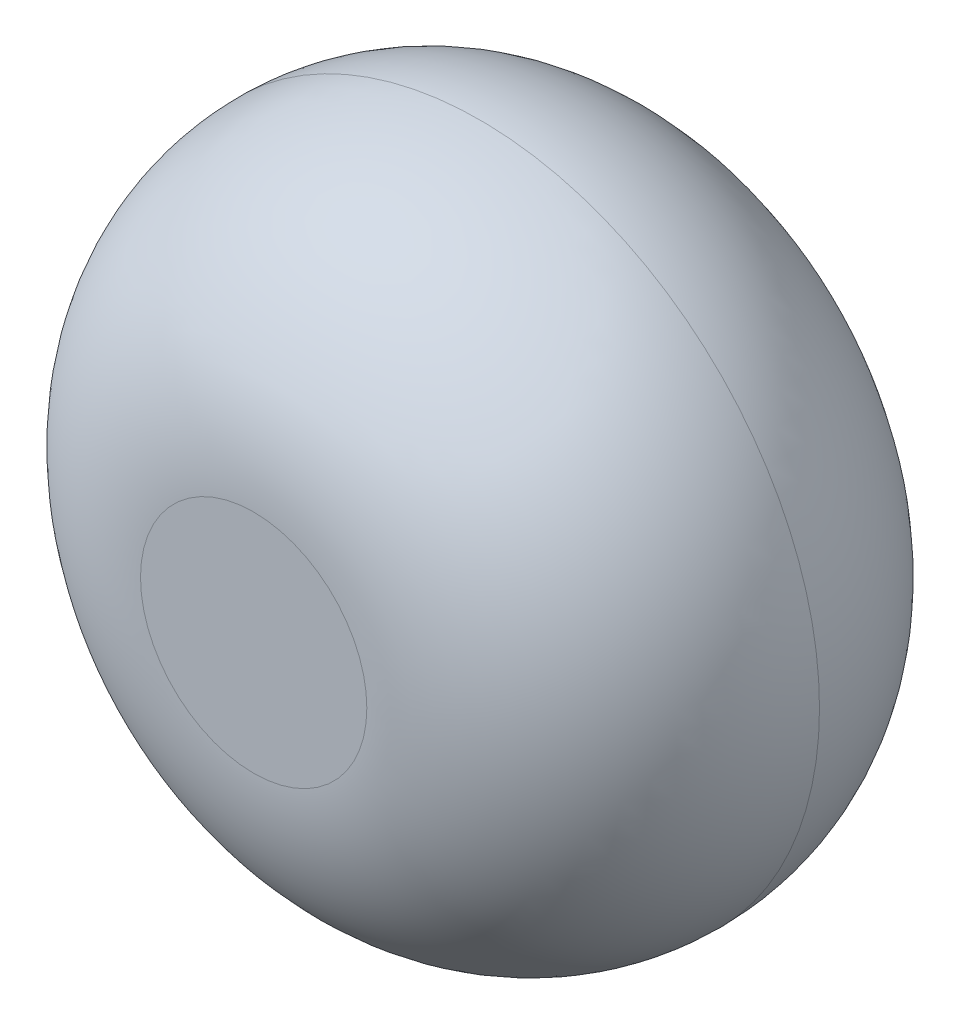
ISO-10303-21;
HEADER;
FILE_DESCRIPTION(('STEP AP214'),'2;1');
FILE_NAME('part.step','',(''),(''),'','','');
FILE_SCHEMA(('AUTOMOTIVE_DESIGN { 1 0 10303 214 1 1 1 1 }'));
ENDSEC;
DATA;
#1=APPLICATION_CONTEXT('core data for automotive mechanical design processes');
#2=APPLICATION_PROTOCOL_DEFINITION('international standard','automotive_design',2000,#1);
#3=PRODUCT_CONTEXT('',#1,'mechanical');
#4=PRODUCT('Part','Part','',(#3));
#5=PRODUCT_RELATED_PRODUCT_CATEGORY('part','',(#4));
#6=PRODUCT_DEFINITION_FORMATION('','',#4);
#7=PRODUCT_DEFINITION_CONTEXT('part definition',#1,'design');
#8=PRODUCT_DEFINITION('design','',#6,#7);
#9=PRODUCT_DEFINITION_SHAPE('','',#8);
#10=(LENGTH_UNIT() NAMED_UNIT(*) SI_UNIT(.MILLI.,.METRE.));
#11=(NAMED_UNIT(*) PLANE_ANGLE_UNIT() SI_UNIT($,.RADIAN.));
#12=(NAMED_UNIT(*) SI_UNIT($,.STERADIAN.) SOLID_ANGLE_UNIT());
#13=UNCERTAINTY_MEASURE_WITH_UNIT(LENGTH_MEASURE(1.E-05),#10,'distance_accuracy_value','');
#14=(GEOMETRIC_REPRESENTATION_CONTEXT(3) GLOBAL_UNCERTAINTY_ASSIGNED_CONTEXT((#13)) GLOBAL_UNIT_ASSIGNED_CONTEXT((#10,
#11,#12)) REPRESENTATION_CONTEXT('',''));
#15=CARTESIAN_POINT('',(0.,0.,0.));
#16=DIRECTION('',(0.,0.,1.));
#17=DIRECTION('',(1.,0.,0.));
#18=AXIS2_PLACEMENT_3D('',#15,#16,#17);
#19=CARTESIAN_POINT('',(0.,0.,50.8));
#20=DIRECTION('',(0.,0.,1.));
#21=DIRECTION('',(1.,0.,0.));
#22=AXIS2_PLACEMENT_3D('',#19,#20,#21);
#23=PLANE('',#22);
#24=CARTESIAN_POINT('',(0.,0.,50.8));
#25=DIRECTION('',(0.,0.,1.));
#26=DIRECTION('',(1.,0.,0.));
#27=AXIS2_PLACEMENT_3D('',#24,#25,#26);
#28=CIRCLE('',#27,12.7);
#29=CARTESIAN_POINT('',(12.7,0.,50.8));
#30=VERTEX_POINT('',#29);
#31=EDGE_CURVE('E10',#30,#30,#28,.T.);
#32=ORIENTED_EDGE('',*,*,#31,.T.);
#33=EDGE_LOOP('',(#32));
#34=FACE_BOUND('',#33,.T.);
#35=ADVANCED_FACE('F31',(#34),#23,.T.);
#36=CARTESIAN_POINT('',(0.,0.,0.));
#37=DIRECTION('',(0.,0.,1.));
#38=DIRECTION('',(1.,0.,0.));
#39=AXIS2_PLACEMENT_3D('',#36,#37,#38);
#40=PLANE('',#39);
#41=CARTESIAN_POINT('',(0.,0.,0.));
#42=DIRECTION('',(0.,0.,1.));
#43=DIRECTION('',(1.,0.,0.));
#44=AXIS2_PLACEMENT_3D('',#41,#42,#43);
#45=CIRCLE('',#44,12.7);
#46=CARTESIAN_POINT('',(12.7,0.,0.));
#47=VERTEX_POINT('',#46);
#48=EDGE_CURVE('E39',#47,#47,#45,.F.);
#49=ORIENTED_EDGE('',*,*,#48,.T.);
#50=EDGE_LOOP('',(#49));
#51=FACE_BOUND('',#50,.T.);
#52=ADVANCED_FACE('F52',(#51),#40,.F.);
#53=CARTESIAN_POINT('',(0.,0.,25.4));
#54=DIRECTION('',(0.,0.,1.));
#55=DIRECTION('',(1.,0.,0.));
#56=AXIS2_PLACEMENT_3D('',#53,#54,#55);
#57=DEGENERATE_TOROIDAL_SURFACE('',#56,12.7,25.4,.T.);
#58=ORIENTED_EDGE('',*,*,#31,.F.);
#59=EDGE_LOOP('',(#58));
#60=FACE_BOUND('',#59,.T.);
#61=CARTESIAN_POINT('',(0.,0.,25.4));
#62=DIRECTION('',(0.,0.,1.));
#63=DIRECTION('',(1.,0.,0.));
#64=AXIS2_PLACEMENT_3D('',#61,#62,#63);
#65=CIRCLE('',#64,38.1);
#66=CARTESIAN_POINT('',(38.1,0.,25.4));
#67=VERTEX_POINT('',#66);
#68=EDGE_CURVE('E35',#67,#67,#65,.F.);
#69=ORIENTED_EDGE('',*,*,#68,.F.);
#70=EDGE_LOOP('',(#69));
#71=FACE_BOUND('',#70,.T.);
#72=ADVANCED_FACE('F33',(#60,#71),#57,.T.);
#73=CARTESIAN_POINT('',(0.,0.,25.4));
#74=DIRECTION('',(0.,0.,1.));
#75=DIRECTION('',(1.,0.,0.));
#76=AXIS2_PLACEMENT_3D('',#73,#74,#75);
#77=DEGENERATE_TOROIDAL_SURFACE('',#76,12.7,25.4,.T.);
#78=ORIENTED_EDGE('',*,*,#48,.F.);
#79=EDGE_LOOP('',(#78));
#80=FACE_BOUND('',#79,.T.);
#81=ORIENTED_EDGE('',*,*,#68,.T.);
#82=EDGE_LOOP('',(#81));
#83=FACE_BOUND('',#82,.T.);
#84=ADVANCED_FACE('F49',(#80,#83),#77,.T.);
#85=CLOSED_SHELL('',(#35,#52,#72,#84));
#86=MANIFOLD_SOLID_BREP('B2',#85);
#87=ADVANCED_BREP_SHAPE_REPRESENTATION('',(#18,#86),#14);
#88=SHAPE_DEFINITION_REPRESENTATION(#9,#87);
ENDSEC;
END-ISO-10303-21;
